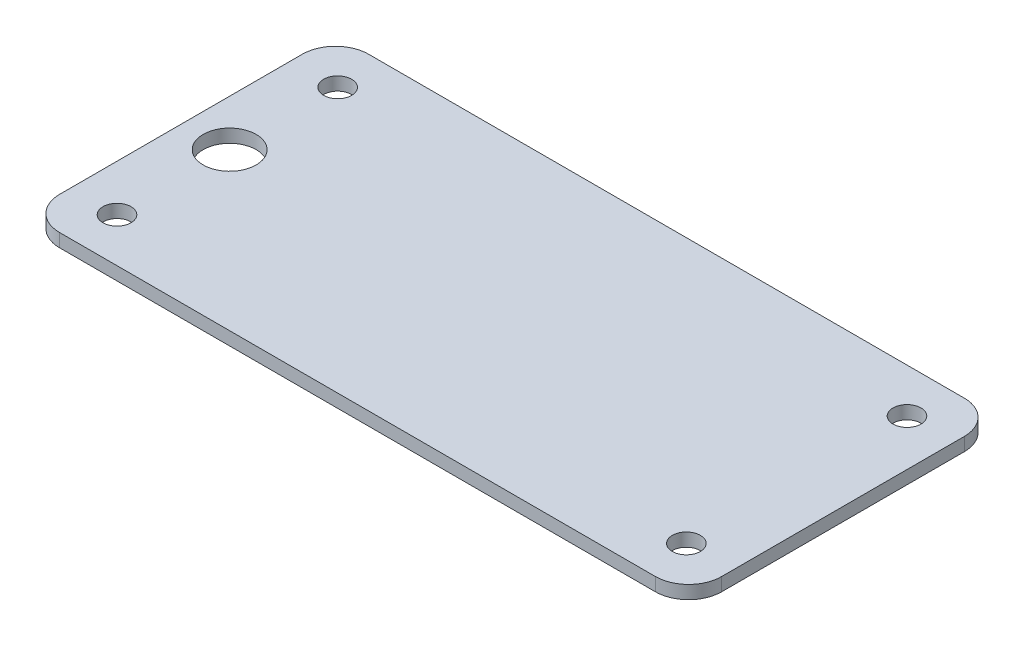
ISO-10303-21;
HEADER;
FILE_DESCRIPTION(('STEP AP214'),'2;1');
FILE_NAME('part.step','',(''),(''),'','','');
FILE_SCHEMA(('AUTOMOTIVE_DESIGN { 1 0 10303 214 1 1 1 1 }'));
ENDSEC;
DATA;
#1=APPLICATION_CONTEXT('core data for automotive mechanical design processes');
#2=APPLICATION_PROTOCOL_DEFINITION('international standard','automotive_design',2000,#1);
#3=PRODUCT_CONTEXT('',#1,'mechanical');
#4=PRODUCT('Part','Part','',(#3));
#5=PRODUCT_RELATED_PRODUCT_CATEGORY('part','',(#4));
#6=PRODUCT_DEFINITION_FORMATION('','',#4);
#7=PRODUCT_DEFINITION_CONTEXT('part definition',#1,'design');
#8=PRODUCT_DEFINITION('design','',#6,#7);
#9=PRODUCT_DEFINITION_SHAPE('','',#8);
#10=(LENGTH_UNIT() NAMED_UNIT(*) SI_UNIT(.MILLI.,.METRE.));
#11=(NAMED_UNIT(*) PLANE_ANGLE_UNIT() SI_UNIT($,.RADIAN.));
#12=(NAMED_UNIT(*) SI_UNIT($,.STERADIAN.) SOLID_ANGLE_UNIT());
#13=UNCERTAINTY_MEASURE_WITH_UNIT(LENGTH_MEASURE(1.E-05),#10,'distance_accuracy_value','');
#14=(GEOMETRIC_REPRESENTATION_CONTEXT(3) GLOBAL_UNCERTAINTY_ASSIGNED_CONTEXT((#13)) GLOBAL_UNIT_ASSIGNED_CONTEXT((#10,
#11,#12)) REPRESENTATION_CONTEXT('',''));
#15=CARTESIAN_POINT('',(0.,0.,0.));
#16=DIRECTION('',(0.,0.,1.));
#17=DIRECTION('',(1.,0.,0.));
#18=AXIS2_PLACEMENT_3D('',#15,#16,#17);
#19=CARTESIAN_POINT('',(0.,3.,0.));
#20=DIRECTION('',(1.,0.,0.));
#21=DIRECTION('',(0.,0.,-1.));
#22=AXIS2_PLACEMENT_3D('',#19,#20,#21);
#23=PLANE('',#22);
#24=DIRECTION('',(0.,0.,1.));
#25=VECTOR('',#24,1.);
#26=CARTESIAN_POINT('',(0.,0.,0.));
#27=LINE('',#26,#25);
#28=CARTESIAN_POINT('',(0.,0.,-62.5));
#29=VERTEX_POINT('',#28);
#30=CARTESIAN_POINT('',(0.,0.,-7.5));
#31=VERTEX_POINT('',#30);
#32=EDGE_CURVE('E127',#29,#31,#27,.T.);
#33=ORIENTED_EDGE('',*,*,#32,.T.);
#34=DIRECTION('',(0.,-1.,0.));
#35=VECTOR('',#34,1.);
#36=CARTESIAN_POINT('',(0.,3.,-7.5));
#37=LINE('',#36,#35);
#38=CARTESIAN_POINT('',(0.,3.,-7.5));
#39=VERTEX_POINT('',#38);
#40=EDGE_CURVE('E105',#31,#39,#37,.F.);
#41=ORIENTED_EDGE('',*,*,#40,.T.);
#42=DIRECTION('',(0.,0.,1.));
#43=VECTOR('',#42,1.);
#44=CARTESIAN_POINT('',(0.,3.,0.));
#45=LINE('',#44,#43);
#46=CARTESIAN_POINT('',(0.,3.,-62.5));
#47=VERTEX_POINT('',#46);
#48=EDGE_CURVE('E137',#47,#39,#45,.T.);
#49=ORIENTED_EDGE('',*,*,#48,.F.);
#50=DIRECTION('',(0.,-1.,0.));
#51=VECTOR('',#50,1.);
#52=CARTESIAN_POINT('',(0.,3.,-62.5));
#53=LINE('',#52,#51);
#54=EDGE_CURVE('E110',#47,#29,#53,.T.);
#55=ORIENTED_EDGE('',*,*,#54,.T.);
#56=EDGE_LOOP('',(#33,#41,#49,#55));
#57=FACE_BOUND('',#56,.T.);
#58=ADVANCED_FACE('F33',(#57),#23,.F.);
#59=CARTESIAN_POINT('',(0.,3.,0.));
#60=DIRECTION('',(0.,0.,-1.));
#61=DIRECTION('',(-1.,0.,0.));
#62=AXIS2_PLACEMENT_3D('',#59,#60,#61);
#63=PLANE('',#62);
#64=DIRECTION('',(1.,0.,0.));
#65=VECTOR('',#64,1.);
#66=CARTESIAN_POINT('',(0.,3.,0.));
#67=LINE('',#66,#65);
#68=CARTESIAN_POINT('',(7.5,3.,0.));
#69=VERTEX_POINT('',#68);
#70=CARTESIAN_POINT('',(142.5,3.,0.));
#71=VERTEX_POINT('',#70);
#72=EDGE_CURVE('E120',#69,#71,#67,.T.);
#73=ORIENTED_EDGE('',*,*,#72,.F.);
#74=DIRECTION('',(0.,-1.,0.));
#75=VECTOR('',#74,1.);
#76=CARTESIAN_POINT('',(7.5,3.,0.));
#77=LINE('',#76,#75);
#78=CARTESIAN_POINT('',(7.5,0.,0.));
#79=VERTEX_POINT('',#78);
#80=EDGE_CURVE('E104',#69,#79,#77,.T.);
#81=ORIENTED_EDGE('',*,*,#80,.T.);
#82=DIRECTION('',(1.,0.,0.));
#83=VECTOR('',#82,1.);
#84=CARTESIAN_POINT('',(0.,0.,0.));
#85=LINE('',#84,#83);
#86=CARTESIAN_POINT('',(142.5,0.,0.));
#87=VERTEX_POINT('',#86);
#88=EDGE_CURVE('E117',#79,#87,#85,.T.);
#89=ORIENTED_EDGE('',*,*,#88,.T.);
#90=DIRECTION('',(0.,-1.,0.));
#91=VECTOR('',#90,1.);
#92=CARTESIAN_POINT('',(142.5,3.,0.));
#93=LINE('',#92,#91);
#94=EDGE_CURVE('E122',#87,#71,#93,.F.);
#95=ORIENTED_EDGE('',*,*,#94,.T.);
#96=EDGE_LOOP('',(#73,#81,#89,#95));
#97=FACE_BOUND('',#96,.T.);
#98=ADVANCED_FACE('F116',(#97),#63,.F.);
#99=CARTESIAN_POINT('',(150.,3.,0.));
#100=DIRECTION('',(-1.,0.,0.));
#101=DIRECTION('',(0.,0.,1.));
#102=AXIS2_PLACEMENT_3D('',#99,#100,#101);
#103=PLANE('',#102);
#104=DIRECTION('',(0.,0.,-1.));
#105=VECTOR('',#104,1.);
#106=CARTESIAN_POINT('',(150.,3.,0.));
#107=LINE('',#106,#105);
#108=CARTESIAN_POINT('',(150.,3.,-7.5));
#109=VERTEX_POINT('',#108);
#110=CARTESIAN_POINT('',(150.,3.,-62.5));
#111=VERTEX_POINT('',#110);
#112=EDGE_CURVE('E164',#109,#111,#107,.T.);
#113=ORIENTED_EDGE('',*,*,#112,.F.);
#114=DIRECTION('',(0.,-1.,0.));
#115=VECTOR('',#114,1.);
#116=CARTESIAN_POINT('',(150.,3.,-7.5));
#117=LINE('',#116,#115);
#118=CARTESIAN_POINT('',(150.,0.,-7.5));
#119=VERTEX_POINT('',#118);
#120=EDGE_CURVE('E156',#109,#119,#117,.T.);
#121=ORIENTED_EDGE('',*,*,#120,.T.);
#122=DIRECTION('',(0.,0.,-1.));
#123=VECTOR('',#122,1.);
#124=CARTESIAN_POINT('',(150.,0.,0.));
#125=LINE('',#124,#123);
#126=CARTESIAN_POINT('',(150.,0.,-62.5));
#127=VERTEX_POINT('',#126);
#128=EDGE_CURVE('E126',#119,#127,#125,.T.);
#129=ORIENTED_EDGE('',*,*,#128,.T.);
#130=DIRECTION('',(0.,-1.,0.));
#131=VECTOR('',#130,1.);
#132=CARTESIAN_POINT('',(150.,3.,-62.5));
#133=LINE('',#132,#131);
#134=EDGE_CURVE('E154',#127,#111,#133,.F.);
#135=ORIENTED_EDGE('',*,*,#134,.T.);
#136=EDGE_LOOP('',(#113,#121,#129,#135));
#137=FACE_BOUND('',#136,.T.);
#138=ADVANCED_FACE('F162',(#137),#103,.F.);
#139=CARTESIAN_POINT('',(0.,3.,-70.));
#140=DIRECTION('',(0.,0.,1.));
#141=DIRECTION('',(1.,0.,0.));
#142=AXIS2_PLACEMENT_3D('',#139,#140,#141);
#143=PLANE('',#142);
#144=DIRECTION('',(-1.,0.,0.));
#145=VECTOR('',#144,1.);
#146=CARTESIAN_POINT('',(0.,3.,-70.));
#147=LINE('',#146,#145);
#148=CARTESIAN_POINT('',(142.5,3.,-70.));
#149=VERTEX_POINT('',#148);
#150=CARTESIAN_POINT('',(7.5,3.,-70.));
#151=VERTEX_POINT('',#150);
#152=EDGE_CURVE('E138',#149,#151,#147,.T.);
#153=ORIENTED_EDGE('',*,*,#152,.F.);
#154=DIRECTION('',(0.,-1.,0.));
#155=VECTOR('',#154,1.);
#156=CARTESIAN_POINT('',(142.5,3.,-70.));
#157=LINE('',#156,#155);
#158=CARTESIAN_POINT('',(142.5,0.,-70.));
#159=VERTEX_POINT('',#158);
#160=EDGE_CURVE('E11',#149,#159,#157,.T.);
#161=ORIENTED_EDGE('',*,*,#160,.T.);
#162=DIRECTION('',(-1.,0.,0.));
#163=VECTOR('',#162,1.);
#164=CARTESIAN_POINT('',(0.,0.,-70.));
#165=LINE('',#164,#163);
#166=CARTESIAN_POINT('',(7.5,0.,-70.));
#167=VERTEX_POINT('',#166);
#168=EDGE_CURVE('E130',#159,#167,#165,.T.);
#169=ORIENTED_EDGE('',*,*,#168,.T.);
#170=DIRECTION('',(0.,-1.,0.));
#171=VECTOR('',#170,1.);
#172=CARTESIAN_POINT('',(7.5,3.,-70.));
#173=LINE('',#172,#171);
#174=EDGE_CURVE('E42',#167,#151,#173,.F.);
#175=ORIENTED_EDGE('',*,*,#174,.T.);
#176=EDGE_LOOP('',(#153,#161,#169,#175));
#177=FACE_BOUND('',#176,.T.);
#178=ADVANCED_FACE('F171',(#177),#143,.F.);
#179=CARTESIAN_POINT('',(0.,3.,0.));
#180=DIRECTION('',(0.,-1.,0.));
#181=DIRECTION('',(0.,0.,-1.));
#182=AXIS2_PLACEMENT_3D('',#179,#180,#181);
#183=PLANE('',#182);
#184=CARTESIAN_POINT('',(10.5,3.,-35.5269641240059));
#185=DIRECTION('',(0.,1.,0.));
#186=DIRECTION('',(0.,0.,1.));
#187=AXIS2_PLACEMENT_3D('',#184,#185,#186);
#188=CIRCLE('',#187,6.);
#189=CARTESIAN_POINT('',(10.5,3.,-29.5269641240059));
#190=VERTEX_POINT('',#189);
#191=EDGE_CURVE('E201',#190,#190,#188,.T.);
#192=ORIENTED_EDGE('',*,*,#191,.F.);
#193=EDGE_LOOP('',(#192));
#194=FACE_BOUND('',#193,.T.);
#195=CARTESIAN_POINT('',(139.500000000001,3.,-10.));
#196=DIRECTION('',(0.,1.,0.));
#197=DIRECTION('',(0.,0.,1.));
#198=AXIS2_PLACEMENT_3D('',#195,#196,#197);
#199=CIRCLE('',#198,3.175);
#200=CARTESIAN_POINT('',(139.500000000001,3.,-6.825));
#201=VERTEX_POINT('',#200);
#202=EDGE_CURVE('E196',#201,#201,#199,.T.);
#203=ORIENTED_EDGE('',*,*,#202,.F.);
#204=EDGE_LOOP('',(#203));
#205=FACE_BOUND('',#204,.T.);
#206=CARTESIAN_POINT('',(139.5,3.,-60.));
#207=DIRECTION('',(0.,1.,0.));
#208=DIRECTION('',(0.,0.,1.));
#209=AXIS2_PLACEMENT_3D('',#206,#207,#208);
#210=CIRCLE('',#209,3.175);
#211=CARTESIAN_POINT('',(139.5,3.,-56.825));
#212=VERTEX_POINT('',#211);
#213=EDGE_CURVE('E190',#212,#212,#210,.T.);
#214=ORIENTED_EDGE('',*,*,#213,.F.);
#215=EDGE_LOOP('',(#214));
#216=FACE_BOUND('',#215,.T.);
#217=CARTESIAN_POINT('',(10.5000000000007,3.,-10.));
#218=DIRECTION('',(0.,1.,0.));
#219=DIRECTION('',(0.,0.,1.));
#220=AXIS2_PLACEMENT_3D('',#217,#218,#219);
#221=CIRCLE('',#220,3.175);
#222=CARTESIAN_POINT('',(10.5000000000007,3.,-6.825));
#223=VERTEX_POINT('',#222);
#224=EDGE_CURVE('E184',#223,#223,#221,.T.);
#225=ORIENTED_EDGE('',*,*,#224,.F.);
#226=EDGE_LOOP('',(#225));
#227=FACE_BOUND('',#226,.T.);
#228=CARTESIAN_POINT('',(10.5,3.,-60.));
#229=DIRECTION('',(0.,1.,0.));
#230=DIRECTION('',(0.,0.,1.));
#231=AXIS2_PLACEMENT_3D('',#228,#229,#230);
#232=CIRCLE('',#231,3.175);
#233=CARTESIAN_POINT('',(10.5,3.,-56.825));
#234=VERTEX_POINT('',#233);
#235=EDGE_CURVE('E178',#234,#234,#232,.T.);
#236=ORIENTED_EDGE('',*,*,#235,.F.);
#237=EDGE_LOOP('',(#236));
#238=FACE_BOUND('',#237,.T.);
#239=ORIENTED_EDGE('',*,*,#48,.T.);
#240=CARTESIAN_POINT('',(7.5,3.,-7.5));
#241=DIRECTION('',(0.,-1.,0.));
#242=DIRECTION('',(0.,0.,-1.));
#243=AXIS2_PLACEMENT_3D('',#240,#241,#242);
#244=CIRCLE('',#243,7.5);
#245=EDGE_CURVE('E152',#39,#69,#244,.F.);
#246=ORIENTED_EDGE('',*,*,#245,.T.);
#247=ORIENTED_EDGE('',*,*,#72,.T.);
#248=CARTESIAN_POINT('',(142.5,3.,-7.5));
#249=DIRECTION('',(0.,-1.,0.));
#250=DIRECTION('',(0.,0.,-1.));
#251=AXIS2_PLACEMENT_3D('',#248,#249,#250);
#252=CIRCLE('',#251,7.5);
#253=EDGE_CURVE('E150',#71,#109,#252,.F.);
#254=ORIENTED_EDGE('',*,*,#253,.T.);
#255=ORIENTED_EDGE('',*,*,#112,.T.);
#256=CARTESIAN_POINT('',(142.5,3.,-62.5));
#257=DIRECTION('',(0.,-1.,0.));
#258=DIRECTION('',(0.,0.,-1.));
#259=AXIS2_PLACEMENT_3D('',#256,#257,#258);
#260=CIRCLE('',#259,7.5);
#261=EDGE_CURVE('E55',#111,#149,#260,.F.);
#262=ORIENTED_EDGE('',*,*,#261,.T.);
#263=ORIENTED_EDGE('',*,*,#152,.T.);
#264=CARTESIAN_POINT('',(7.5,3.,-62.5));
#265=DIRECTION('',(0.,-1.,0.));
#266=DIRECTION('',(0.,0.,-1.));
#267=AXIS2_PLACEMENT_3D('',#264,#265,#266);
#268=CIRCLE('',#267,7.5);
#269=EDGE_CURVE('E147',#151,#47,#268,.F.);
#270=ORIENTED_EDGE('',*,*,#269,.T.);
#271=EDGE_LOOP('',(#239,#246,#247,#254,#255,#262,#263,#270));
#272=FACE_BOUND('',#271,.T.);
#273=ADVANCED_FACE('F213',(#194,#205,#216,#227,#238,#272),#183,.F.);
#274=CARTESIAN_POINT('',(0.,0.,0.));
#275=DIRECTION('',(0.,-1.,0.));
#276=DIRECTION('',(0.,0.,-1.));
#277=AXIS2_PLACEMENT_3D('',#274,#275,#276);
#278=PLANE('',#277);
#279=CARTESIAN_POINT('',(10.5,0.,-35.5269641240059));
#280=DIRECTION('',(0.,-1.,0.));
#281=DIRECTION('',(0.,0.,-1.));
#282=AXIS2_PLACEMENT_3D('',#279,#280,#281);
#283=CIRCLE('',#282,6.);
#284=CARTESIAN_POINT('',(10.5,0.,-41.5269641240059));
#285=VERTEX_POINT('',#284);
#286=EDGE_CURVE('E37',#285,#285,#283,.T.);
#287=ORIENTED_EDGE('',*,*,#286,.F.);
#288=EDGE_LOOP('',(#287));
#289=FACE_BOUND('',#288,.T.);
#290=CARTESIAN_POINT('',(139.500000000001,0.,-10.));
#291=DIRECTION('',(0.,1.,0.));
#292=DIRECTION('',(0.,0.,1.));
#293=AXIS2_PLACEMENT_3D('',#290,#291,#292);
#294=CIRCLE('',#293,3.175);
#295=CARTESIAN_POINT('',(139.500000000001,0.,-6.825));
#296=VERTEX_POINT('',#295);
#297=EDGE_CURVE('E193',#296,#296,#294,.T.);
#298=ORIENTED_EDGE('',*,*,#297,.T.);
#299=EDGE_LOOP('',(#298));
#300=FACE_BOUND('',#299,.T.);
#301=CARTESIAN_POINT('',(139.5,0.,-60.));
#302=DIRECTION('',(0.,1.,0.));
#303=DIRECTION('',(0.,0.,1.));
#304=AXIS2_PLACEMENT_3D('',#301,#302,#303);
#305=CIRCLE('',#304,3.175);
#306=CARTESIAN_POINT('',(139.5,0.,-56.825));
#307=VERTEX_POINT('',#306);
#308=EDGE_CURVE('E187',#307,#307,#305,.T.);
#309=ORIENTED_EDGE('',*,*,#308,.T.);
#310=EDGE_LOOP('',(#309));
#311=FACE_BOUND('',#310,.T.);
#312=CARTESIAN_POINT('',(10.5000000000007,0.,-10.));
#313=DIRECTION('',(0.,1.,0.));
#314=DIRECTION('',(0.,0.,1.));
#315=AXIS2_PLACEMENT_3D('',#312,#313,#314);
#316=CIRCLE('',#315,3.175);
#317=CARTESIAN_POINT('',(10.5000000000007,0.,-6.825));
#318=VERTEX_POINT('',#317);
#319=EDGE_CURVE('E181',#318,#318,#316,.T.);
#320=ORIENTED_EDGE('',*,*,#319,.T.);
#321=EDGE_LOOP('',(#320));
#322=FACE_BOUND('',#321,.T.);
#323=CARTESIAN_POINT('',(10.5,0.,-60.));
#324=DIRECTION('',(0.,1.,0.));
#325=DIRECTION('',(0.,0.,1.));
#326=AXIS2_PLACEMENT_3D('',#323,#324,#325);
#327=CIRCLE('',#326,3.175);
#328=CARTESIAN_POINT('',(10.5,0.,-56.825));
#329=VERTEX_POINT('',#328);
#330=EDGE_CURVE('E132',#329,#329,#327,.T.);
#331=ORIENTED_EDGE('',*,*,#330,.T.);
#332=EDGE_LOOP('',(#331));
#333=FACE_BOUND('',#332,.T.);
#334=ORIENTED_EDGE('',*,*,#88,.F.);
#335=CARTESIAN_POINT('',(7.5,0.,-7.5));
#336=DIRECTION('',(0.,-1.,0.));
#337=DIRECTION('',(0.,0.,-1.));
#338=AXIS2_PLACEMENT_3D('',#335,#336,#337);
#339=CIRCLE('',#338,7.5);
#340=EDGE_CURVE('E100',#79,#31,#339,.T.);
#341=ORIENTED_EDGE('',*,*,#340,.T.);
#342=ORIENTED_EDGE('',*,*,#32,.F.);
#343=CARTESIAN_POINT('',(7.5,0.,-62.5));
#344=DIRECTION('',(0.,-1.,0.));
#345=DIRECTION('',(0.,0.,-1.));
#346=AXIS2_PLACEMENT_3D('',#343,#344,#345);
#347=CIRCLE('',#346,7.5);
#348=EDGE_CURVE('E121',#29,#167,#347,.T.);
#349=ORIENTED_EDGE('',*,*,#348,.T.);
#350=ORIENTED_EDGE('',*,*,#168,.F.);
#351=CARTESIAN_POINT('',(142.5,0.,-62.5));
#352=DIRECTION('',(0.,-1.,0.));
#353=DIRECTION('',(0.,0.,-1.));
#354=AXIS2_PLACEMENT_3D('',#351,#352,#353);
#355=CIRCLE('',#354,7.5);
#356=EDGE_CURVE('E141',#159,#127,#355,.T.);
#357=ORIENTED_EDGE('',*,*,#356,.T.);
#358=ORIENTED_EDGE('',*,*,#128,.F.);
#359=CARTESIAN_POINT('',(142.5,0.,-7.5));
#360=DIRECTION('',(0.,-1.,0.));
#361=DIRECTION('',(0.,0.,-1.));
#362=AXIS2_PLACEMENT_3D('',#359,#360,#361);
#363=CIRCLE('',#362,7.5);
#364=EDGE_CURVE('E111',#119,#87,#363,.T.);
#365=ORIENTED_EDGE('',*,*,#364,.T.);
#366=EDGE_LOOP('',(#334,#341,#342,#349,#350,#357,#358,#365));
#367=FACE_BOUND('',#366,.T.);
#368=ADVANCED_FACE('F124',(#289,#300,#311,#322,#333,#367),#278,.T.);
#369=CARTESIAN_POINT('',(10.5,0.,-60.));
#370=DIRECTION('',(0.,1.,0.));
#371=DIRECTION('',(0.,0.,1.));
#372=AXIS2_PLACEMENT_3D('',#369,#370,#371);
#373=CYLINDRICAL_SURFACE('',#372,3.175);
#374=ORIENTED_EDGE('',*,*,#330,.F.);
#375=EDGE_LOOP('',(#374));
#376=FACE_BOUND('',#375,.T.);
#377=ORIENTED_EDGE('',*,*,#235,.T.);
#378=EDGE_LOOP('',(#377));
#379=FACE_BOUND('',#378,.T.);
#380=ADVANCED_FACE('F212',(#376,#379),#373,.F.);
#381=CARTESIAN_POINT('',(10.5000000000007,0.,-10.));
#382=DIRECTION('',(0.,1.,0.));
#383=DIRECTION('',(0.,0.,1.));
#384=AXIS2_PLACEMENT_3D('',#381,#382,#383);
#385=CYLINDRICAL_SURFACE('',#384,3.175);
#386=ORIENTED_EDGE('',*,*,#319,.F.);
#387=EDGE_LOOP('',(#386));
#388=FACE_BOUND('',#387,.T.);
#389=ORIENTED_EDGE('',*,*,#224,.T.);
#390=EDGE_LOOP('',(#389));
#391=FACE_BOUND('',#390,.T.);
#392=ADVANCED_FACE('F225',(#388,#391),#385,.F.);
#393=CARTESIAN_POINT('',(139.5,0.,-60.));
#394=DIRECTION('',(0.,1.,0.));
#395=DIRECTION('',(0.,0.,1.));
#396=AXIS2_PLACEMENT_3D('',#393,#394,#395);
#397=CYLINDRICAL_SURFACE('',#396,3.175);
#398=ORIENTED_EDGE('',*,*,#308,.F.);
#399=EDGE_LOOP('',(#398));
#400=FACE_BOUND('',#399,.T.);
#401=ORIENTED_EDGE('',*,*,#213,.T.);
#402=EDGE_LOOP('',(#401));
#403=FACE_BOUND('',#402,.T.);
#404=ADVANCED_FACE('F298',(#400,#403),#397,.F.);
#405=CARTESIAN_POINT('',(139.500000000001,0.,-10.));
#406=DIRECTION('',(0.,1.,0.));
#407=DIRECTION('',(0.,0.,1.));
#408=AXIS2_PLACEMENT_3D('',#405,#406,#407);
#409=CYLINDRICAL_SURFACE('',#408,3.175);
#410=ORIENTED_EDGE('',*,*,#297,.F.);
#411=EDGE_LOOP('',(#410));
#412=FACE_BOUND('',#411,.T.);
#413=ORIENTED_EDGE('',*,*,#202,.T.);
#414=EDGE_LOOP('',(#413));
#415=FACE_BOUND('',#414,.T.);
#416=ADVANCED_FACE('F254',(#412,#415),#409,.F.);
#417=CARTESIAN_POINT('',(7.5,3.,-7.5));
#418=DIRECTION('',(0.,-1.,0.));
#419=DIRECTION('',(0.,0.,-1.));
#420=AXIS2_PLACEMENT_3D('',#417,#418,#419);
#421=CYLINDRICAL_SURFACE('',#420,7.5);
#422=ORIENTED_EDGE('',*,*,#245,.F.);
#423=ORIENTED_EDGE('',*,*,#40,.F.);
#424=ORIENTED_EDGE('',*,*,#340,.F.);
#425=ORIENTED_EDGE('',*,*,#80,.F.);
#426=EDGE_LOOP('',(#422,#423,#424,#425));
#427=FACE_BOUND('',#426,.T.);
#428=ADVANCED_FACE('F103',(#427),#421,.T.);
#429=CARTESIAN_POINT('',(142.5,3.,-7.5));
#430=DIRECTION('',(0.,-1.,0.));
#431=DIRECTION('',(0.,0.,-1.));
#432=AXIS2_PLACEMENT_3D('',#429,#430,#431);
#433=CYLINDRICAL_SURFACE('',#432,7.5);
#434=ORIENTED_EDGE('',*,*,#253,.F.);
#435=ORIENTED_EDGE('',*,*,#94,.F.);
#436=ORIENTED_EDGE('',*,*,#364,.F.);
#437=ORIENTED_EDGE('',*,*,#120,.F.);
#438=EDGE_LOOP('',(#434,#435,#436,#437));
#439=FACE_BOUND('',#438,.T.);
#440=ADVANCED_FACE('F242',(#439),#433,.T.);
#441=CARTESIAN_POINT('',(142.5,3.,-62.5));
#442=DIRECTION('',(0.,-1.,0.));
#443=DIRECTION('',(0.,0.,-1.));
#444=AXIS2_PLACEMENT_3D('',#441,#442,#443);
#445=CYLINDRICAL_SURFACE('',#444,7.5);
#446=ORIENTED_EDGE('',*,*,#261,.F.);
#447=ORIENTED_EDGE('',*,*,#134,.F.);
#448=ORIENTED_EDGE('',*,*,#356,.F.);
#449=ORIENTED_EDGE('',*,*,#160,.F.);
#450=EDGE_LOOP('',(#446,#447,#448,#449));
#451=FACE_BOUND('',#450,.T.);
#452=ADVANCED_FACE('F170',(#451),#445,.T.);
#453=CARTESIAN_POINT('',(7.5,3.,-62.5));
#454=DIRECTION('',(0.,-1.,0.));
#455=DIRECTION('',(0.,0.,-1.));
#456=AXIS2_PLACEMENT_3D('',#453,#454,#455);
#457=CYLINDRICAL_SURFACE('',#456,7.5);
#458=ORIENTED_EDGE('',*,*,#269,.F.);
#459=ORIENTED_EDGE('',*,*,#174,.F.);
#460=ORIENTED_EDGE('',*,*,#348,.F.);
#461=ORIENTED_EDGE('',*,*,#54,.F.);
#462=EDGE_LOOP('',(#458,#459,#460,#461));
#463=FACE_BOUND('',#462,.T.);
#464=ADVANCED_FACE('F35',(#463),#457,.T.);
#465=CARTESIAN_POINT('',(10.5,-7.,-35.5269641240059));
#466=DIRECTION('',(0.,1.,0.));
#467=DIRECTION('',(0.,0.,1.));
#468=AXIS2_PLACEMENT_3D('',#465,#466,#467);
#469=CYLINDRICAL_SURFACE('',#468,6.);
#470=ORIENTED_EDGE('',*,*,#286,.T.);
#471=EDGE_LOOP('',(#470));
#472=FACE_BOUND('',#471,.T.);
#473=ORIENTED_EDGE('',*,*,#191,.T.);
#474=EDGE_LOOP('',(#473));
#475=FACE_BOUND('',#474,.T.);
#476=ADVANCED_FACE('F208',(#472,#475),#469,.F.);
#477=CLOSED_SHELL('',(#58,#98,#138,#178,#273,#368,#380,#392,#404,#416,#428,#440,#452,#464,#476));
#478=MANIFOLD_SOLID_BREP('B2',#477);
#479=ADVANCED_BREP_SHAPE_REPRESENTATION('',(#18,#478),#14);
#480=SHAPE_DEFINITION_REPRESENTATION(#9,#479);
ENDSEC;
END-ISO-10303-21;
